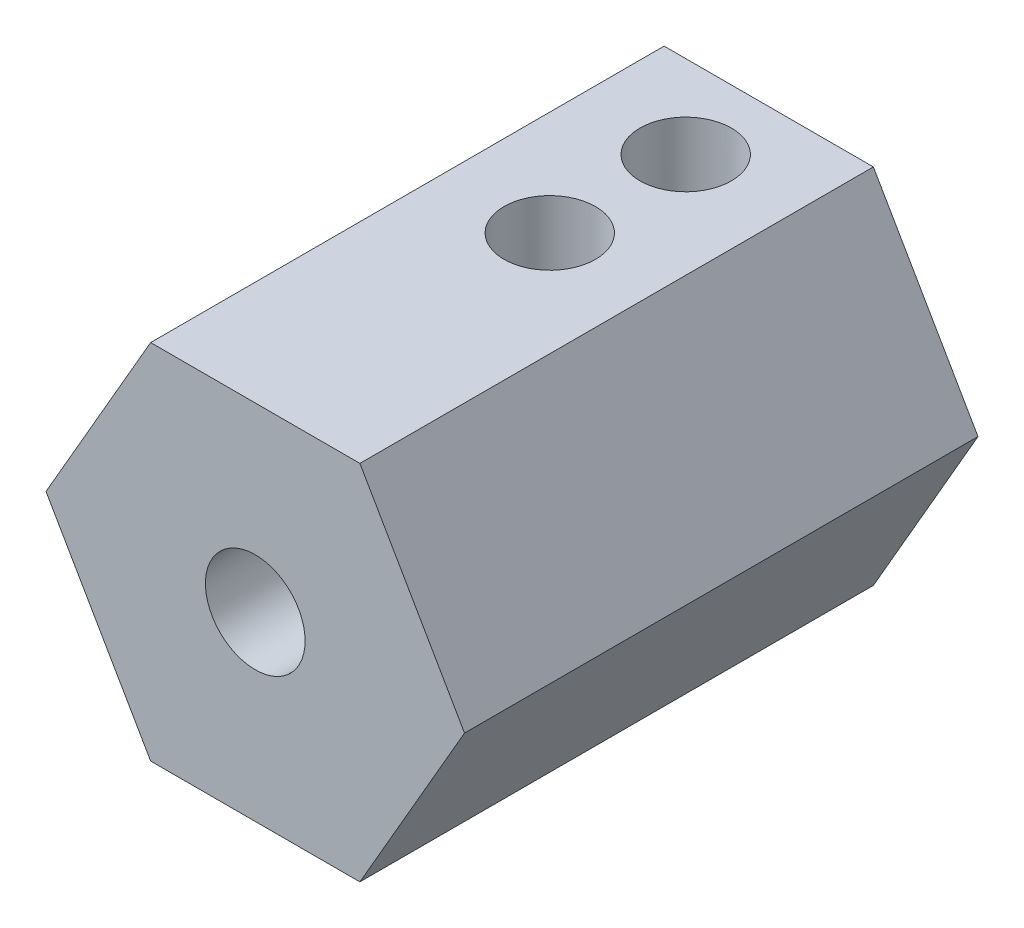
ISO-10303-21;
HEADER;
FILE_DESCRIPTION(('STEP AP214'),'2;1');
FILE_NAME('part.step','',(''),(''),'','','');
FILE_SCHEMA(('AUTOMOTIVE_DESIGN { 1 0 10303 214 1 1 1 1 }'));
ENDSEC;
DATA;
#1=APPLICATION_CONTEXT('core data for automotive mechanical design processes');
#2=APPLICATION_PROTOCOL_DEFINITION('international standard','automotive_design',2000,#1);
#3=PRODUCT_CONTEXT('',#1,'mechanical');
#4=PRODUCT('Part','Part','',(#3));
#5=PRODUCT_RELATED_PRODUCT_CATEGORY('part','',(#4));
#6=PRODUCT_DEFINITION_FORMATION('','',#4);
#7=PRODUCT_DEFINITION_CONTEXT('part definition',#1,'design');
#8=PRODUCT_DEFINITION('design','',#6,#7);
#9=PRODUCT_DEFINITION_SHAPE('','',#8);
#10=(LENGTH_UNIT() NAMED_UNIT(*) SI_UNIT(.MILLI.,.METRE.));
#11=(NAMED_UNIT(*) PLANE_ANGLE_UNIT() SI_UNIT($,.RADIAN.));
#12=(NAMED_UNIT(*) SI_UNIT($,.STERADIAN.) SOLID_ANGLE_UNIT());
#13=UNCERTAINTY_MEASURE_WITH_UNIT(LENGTH_MEASURE(1.E-05),#10,'distance_accuracy_value','');
#14=(GEOMETRIC_REPRESENTATION_CONTEXT(3) GLOBAL_UNCERTAINTY_ASSIGNED_CONTEXT((#13)) GLOBAL_UNIT_ASSIGNED_CONTEXT((#10,
#11,#12)) REPRESENTATION_CONTEXT('',''));
#15=CARTESIAN_POINT('',(0.,0.,0.));
#16=DIRECTION('',(0.,0.,1.));
#17=DIRECTION('',(1.,0.,0.));
#18=AXIS2_PLACEMENT_3D('',#15,#16,#17);
#19=CARTESIAN_POINT('',(0.,0.,10.));
#20=DIRECTION('',(0.,0.,-1.));
#21=DIRECTION('',(-1.,0.,0.));
#22=AXIS2_PLACEMENT_3D('',#19,#20,#21);
#23=CYLINDRICAL_SURFACE('',#22,2.025);
#24=CARTESIAN_POINT('',(0.,2.025,1.235));
#25=CARTESIAN_POINT('',(-0.0739928868056618,2.02499565190528,1.23500453512397));
#26=CARTESIAN_POINT('',(-0.148111325394092,2.02090129294461,1.24046521410863));
#27=CARTESIAN_POINT('',(-0.294023752283511,2.00489263007424,1.26196632140887));
#28=CARTESIAN_POINT('',(-0.365811185940954,1.99295799311726,1.27803425921649));
#29=CARTESIAN_POINT('',(-0.50454758984234,1.96241503224953,1.31966048772123));
#30=CARTESIAN_POINT('',(-0.571523148943039,1.94384742440607,1.34516091083884));
#31=CARTESIAN_POINT('',(-0.699799568974711,1.9014404117609,1.40445029071054));
#32=CARTESIAN_POINT('',(-0.761102223115065,1.8776026809794,1.43823661587343));
#33=CARTESIAN_POINT('',(-0.882766745900167,1.82377938276367,1.51644685777928));
#34=CARTESIAN_POINT('',(-0.942517219355931,1.79342912301261,1.56156561451561));
#35=CARTESIAN_POINT('',(-1.05411014702154,1.73020241051101,1.65931631383231));
#36=CARTESIAN_POINT('',(-1.10594004995473,1.69732206992881,1.71195993034544));
#37=CARTESIAN_POINT('',(-1.21101588768082,1.62447699595715,1.83539013856251));
#38=CARTESIAN_POINT('',(-1.26242821275426,1.58442438367897,1.90769277321892));
#39=CARTESIAN_POINT('',(-1.35255611678433,1.50820507978462,2.06170048447587));
#40=CARTESIAN_POINT('',(-1.39128927428173,1.47203305528554,2.14339232949708));
#41=CARTESIAN_POINT('',(-1.443530284921,1.42045979647629,2.28623627211062));
#42=CARTESIAN_POINT('',(-1.46113413550471,1.40218785640664,2.34483951504784));
#43=CARTESIAN_POINT('',(-1.48928662319109,1.37225214642226,2.46529281123202));
#44=CARTESIAN_POINT('',(-1.49985135050266,1.36057331521485,2.52713510881354));
#45=CARTESIAN_POINT('',(-1.51324765708928,1.34566661642272,2.65328000032195));
#46=CARTESIAN_POINT('',(-1.51601008617692,1.34251432818528,2.71759950427649));
#47=CARTESIAN_POINT('',(-1.51332532550786,1.34553830556832,2.84585886973358));
#48=CARTESIAN_POINT('',(-1.50787501717649,1.35171811481345,2.90979857776146));
#49=CARTESIAN_POINT('',(-1.49026122308344,1.37108998181118,3.02851690246804));
#50=CARTESIAN_POINT('',(-1.47886413619809,1.38347611341034,3.08355172244358));
#51=CARTESIAN_POINT('',(-1.45052143874708,1.41316475638683,3.1907868079349));
#52=CARTESIAN_POINT('',(-1.43357054940532,1.4304719430501,3.24298432140108));
#53=CARTESIAN_POINT('',(-1.38255613672714,1.48023293187179,3.37571050720384));
#54=CARTESIAN_POINT('',(-1.34440845602762,1.51540904884652,3.45364954944682));
#55=CARTESIAN_POINT('',(-1.25640314993998,1.58914874214825,3.60091761712356));
#56=CARTESIAN_POINT('',(-1.2065172183523,1.62772036358212,3.67022520048388));
#57=CARTESIAN_POINT('',(-1.09431931730027,1.70524441606206,3.80133641930668));
#58=CARTESIAN_POINT('',(-1.03173271116824,1.7441830027319,3.86291445023724));
#59=CARTESIAN_POINT('',(-0.895460138719062,1.81789894235418,3.97521039887268));
#60=CARTESIAN_POINT('',(-0.821796000181357,1.85268424257525,4.02594920912816));
#61=CARTESIAN_POINT('',(-0.680190487497888,1.90854254300791,4.10564175246017));
#62=CARTESIAN_POINT('',(-0.614098016930652,1.93096606100245,4.13692567702699));
#63=CARTESIAN_POINT('',(-0.476446044736619,1.9694459256481,4.19001855009483));
#64=CARTESIAN_POINT('',(-0.404890026525063,1.9855062895108,4.21183347743455));
#65=CARTESIAN_POINT('',(-0.257593419610673,2.0099430981957,4.24485653383498));
#66=CARTESIAN_POINT('',(-0.181830228152549,2.01827269227101,4.25600000349218));
#67=CARTESIAN_POINT('',(-0.0290402150354437,2.02623391100399,4.2666534107521));
#68=CARTESIAN_POINT('',(0.0479860833872775,2.02586905066897,4.26616804967582));
#69=CARTESIAN_POINT('',(0.192938393612172,2.01696535316096,4.25424760622859));
#70=CARTESIAN_POINT('',(0.261009683917031,2.00924027303096,4.24390258564786));
#71=CARTESIAN_POINT('',(0.394144043908506,1.98741752994079,4.21442018137838));
#72=CARTESIAN_POINT('',(0.459206459346709,1.97331848814401,4.19528089527016));
#73=CARTESIAN_POINT('',(0.587286498717926,1.93914346660441,4.14826599337024));
#74=CARTESIAN_POINT('',(0.650140041832414,1.91886610757916,4.12009402620657));
#75=CARTESIAN_POINT('',(0.770224139616118,1.87389879339671,4.05637110412412));
#76=CARTESIAN_POINT('',(0.827453923154029,1.84920823440526,4.02081913933268));
#77=CARTESIAN_POINT('',(0.94489750386441,1.79240828730101,3.936780489347));
#78=CARTESIAN_POINT('',(1.00400652229484,1.75974891449147,3.88712476006765));
#79=CARTESIAN_POINT('',(1.11363625190585,1.69250964066191,3.7800137044255));
#80=CARTESIAN_POINT('',(1.16413704660418,1.65792552504052,3.72254082928527));
#81=CARTESIAN_POINT('',(1.26479076695848,1.5828954211597,3.58892918745216));
#82=CARTESIAN_POINT('',(1.31308903983746,1.54257135051493,3.51131321975315));
#83=CARTESIAN_POINT('',(1.39575265690636,1.46818880450116,3.3462864806162));
#84=CARTESIAN_POINT('',(1.43016103210157,1.43411115958382,3.25890704745203));
#85=CARTESIAN_POINT('',(1.47248925798078,1.39030427653719,3.11109882081068));
#86=CARTESIAN_POINT('',(1.48550631183736,1.37626107893422,3.05342568063169));
#87=CARTESIAN_POINT('',(1.50474426700448,1.35520399562413,2.93575888012743));
#88=CARTESIAN_POINT('',(1.51098007761049,1.34817469193307,2.87577061201641));
#89=CARTESIAN_POINT('',(1.51620650324394,1.34229765473705,2.75477227566852));
#90=CARTESIAN_POINT('',(1.51516296373308,1.34348848965506,2.69375873234714));
#91=CARTESIAN_POINT('',(1.50584329033189,1.3539216008395,2.57295766096291));
#92=CARTESIAN_POINT('',(1.49755753043625,1.36317459287952,2.51317187305965));
#93=CARTESIAN_POINT('',(1.47170711784459,1.39109109020378,2.38304513500668));
#94=CARTESIAN_POINT('',(1.45245647034243,1.41142025529433,2.31340896079947));
#95=CARTESIAN_POINT('',(1.40524942835992,1.45842590385322,2.17940827814892));
#96=CARTESIAN_POINT('',(1.37727114996513,1.48511830256193,2.11505754073081));
#97=CARTESIAN_POINT('',(1.30273784307717,1.55136885295852,1.97108070986939));
#98=CARTESIAN_POINT('',(1.2531003028388,1.59222498348684,1.89364976432364));
#99=CARTESIAN_POINT('',(1.14092179117134,1.67444889745318,1.74905160300486));
#100=CARTESIAN_POINT('',(1.07836997199996,1.71581708336759,1.68189309898061));
#101=CARTESIAN_POINT('',(0.940349737037024,1.79520430249079,1.55853368396161));
#102=CARTESIAN_POINT('',(0.864790777571966,1.83319681867686,1.50241593058162));
#103=CARTESIAN_POINT('',(0.702018007126385,1.90145316200589,1.40412874983053));
#104=CARTESIAN_POINT('',(0.614832738366764,1.93173540415168,1.36192601566243));
#105=CARTESIAN_POINT('',(0.458223094182456,1.97362139699335,1.30430195673951));
#106=CARTESIAN_POINT('',(0.39110263626678,1.98809887628711,1.28465534362082));
#107=CARTESIAN_POINT('',(0.253803711121769,2.01022527103696,1.25477106897417));
#108=CARTESIAN_POINT('',(0.183634559151203,2.01789363761182,1.24450660363258));
#109=CARTESIAN_POINT('',(0.0942093811466056,2.02289578696553,1.23781371471486));
#110=CARTESIAN_POINT('',(0.0753950485035797,2.02368363611827,1.23675986526243));
#111=CARTESIAN_POINT('',(0.0377232017635754,2.02473633487149,1.23535237897461));
#112=CARTESIAN_POINT('',(0.0188656818006056,2.02500110861699,1.23499884369688));
#113=CARTESIAN_POINT('',(0.,2.025,1.235));
#114=B_SPLINE_CURVE_WITH_KNOTS('',3,(#24,#25,#26,#27,#28,#29,#30,#31,#32,#33,#34,#35,#36,#37,
#38,#39,#40,#41,#42,#43,#44,#45,#46,#47,#48,#49,#50,#51,#52,#53,#54,#55,#56,#57,#58,#59,#60,#61,
#62,#63,#64,#65,#66,#67,#68,#69,#70,#71,#72,#73,#74,#75,#76,#77,#78,#79,#80,#81,#82,#83,#84,#85,
#86,#87,#88,#89,#90,#91,#92,#93,#94,#95,#96,#97,#98,#99,#100,#101,#102,#103,#104,#105,#106,#107,
#108,#109,#110,#111,#112,#113),.UNSPECIFIED.,.T.,.F.,(4,2,2,2,2,2,2,2,2,2,2,2,2,2,2,2,2,2,2,2,2,
2,2,2,2,2,2,2,2,2,2,2,2,2,2,2,2,2,2,2,2,2,2,2,4),(0.,0.221895599142627,0.444368948235988,
0.665499484915247,0.886559881582525,1.12806569545117,1.36995032762094,1.66075484903069,
1.95115447116898,2.14208603976122,2.33257966093106,2.52475636952016,2.71700607063708,
2.88903467847803,3.06122727266009,3.34060465381823,3.62066277152428,3.90758631915396,
4.19395173073889,4.4224819275015,4.65086761690028,4.88062852215421,5.11029654089535,
5.31720076274683,5.52414976424107,5.7387363438516,5.95335230668855,6.20390249176825,
6.45502471955811,6.7534144301631,7.05087249892815,7.23249545476855,7.41371828052448,
7.59579196950383,7.77810803056935,8.00202975779208,8.22651752826005,8.52693409339032,
8.82760403680624,9.13045850005745,9.43258270168355,9.64597557565269,9.85875688550531,
9.91532455040445,9.97190041799257),.UNSPECIFIED.);
#115=CARTESIAN_POINT('',(0.,2.025,1.235));
#116=VERTEX_POINT('',#115);
#117=EDGE_CURVE('E147',#116,#116,#114,.T.);
#118=ORIENTED_EDGE('',*,*,#117,.T.);
#119=EDGE_LOOP('',(#118));
#120=FACE_BOUND('',#119,.T.);
#121=CARTESIAN_POINT('',(0.,0.,10.));
#122=DIRECTION('',(0.,0.,1.));
#123=DIRECTION('',(1.,0.,0.));
#124=AXIS2_PLACEMENT_3D('',#121,#122,#123);
#125=CIRCLE('',#124,2.025);
#126=CARTESIAN_POINT('',(2.025,0.,10.));
#127=VERTEX_POINT('',#126);
#128=EDGE_CURVE('E144',#127,#127,#125,.T.);
#129=ORIENTED_EDGE('',*,*,#128,.T.);
#130=EDGE_LOOP('',(#129));
#131=FACE_BOUND('',#130,.T.);
#132=CARTESIAN_POINT('',(0.,0.,0.));
#133=DIRECTION('',(0.,0.,1.));
#134=DIRECTION('',(1.,0.,0.));
#135=AXIS2_PLACEMENT_3D('',#132,#133,#134);
#136=CIRCLE('',#135,2.025);
#137=CARTESIAN_POINT('',(2.025,0.,0.));
#138=VERTEX_POINT('',#137);
#139=EDGE_CURVE('E128',#138,#138,#136,.F.);
#140=ORIENTED_EDGE('',*,*,#139,.T.);
#141=EDGE_LOOP('',(#140));
#142=FACE_BOUND('',#141,.T.);
#143=CARTESIAN_POINT('',(0.,2.025,5.735));
#144=CARTESIAN_POINT('',(-0.0739928868056618,2.02499565190528,5.73500453512397));
#145=CARTESIAN_POINT('',(-0.148111325394092,2.02090129294461,5.74046521410863));
#146=CARTESIAN_POINT('',(-0.294023752283511,2.00489263007424,5.76196632140887));
#147=CARTESIAN_POINT('',(-0.365811185940954,1.99295799311726,5.77803425921649));
#148=CARTESIAN_POINT('',(-0.50454758984234,1.96241503224953,5.81966048772123));
#149=CARTESIAN_POINT('',(-0.571523148943039,1.94384742440607,5.84516091083884));
#150=CARTESIAN_POINT('',(-0.699799568974711,1.9014404117609,5.90445029071054));
#151=CARTESIAN_POINT('',(-0.761102223115066,1.8776026809794,5.93823661587343));
#152=CARTESIAN_POINT('',(-0.882766745900167,1.82377938276367,6.01644685777929));
#153=CARTESIAN_POINT('',(-0.942517219355931,1.79342912301261,6.06156561451561));
#154=CARTESIAN_POINT('',(-1.05411014702154,1.730202410511,6.15931631383231));
#155=CARTESIAN_POINT('',(-1.10594004995473,1.69732206992881,6.21195993034544));
#156=CARTESIAN_POINT('',(-1.21101588768082,1.62447699595715,6.33539013856251));
#157=CARTESIAN_POINT('',(-1.26242821275426,1.58442438367897,6.40769277321892));
#158=CARTESIAN_POINT('',(-1.35255611678434,1.50820507978462,6.56170048447587));
#159=CARTESIAN_POINT('',(-1.39128927428173,1.47203305528554,6.64339232949708));
#160=CARTESIAN_POINT('',(-1.443530284921,1.42045979647629,6.78623627211062));
#161=CARTESIAN_POINT('',(-1.46113413550471,1.40218785640664,6.84483951504784));
#162=CARTESIAN_POINT('',(-1.48928662319109,1.37225214642226,6.96529281123202));
#163=CARTESIAN_POINT('',(-1.49985135050266,1.36057331521485,7.02713510881354));
#164=CARTESIAN_POINT('',(-1.51324765708928,1.34566661642272,7.15328000032195));
#165=CARTESIAN_POINT('',(-1.51601008617692,1.34251432818528,7.21759950427649));
#166=CARTESIAN_POINT('',(-1.51332532550786,1.34553830556832,7.34585886973358));
#167=CARTESIAN_POINT('',(-1.50787501717649,1.35171811481345,7.40979857776146));
#168=CARTESIAN_POINT('',(-1.49026122308344,1.37108998181118,7.52851690246804));
#169=CARTESIAN_POINT('',(-1.47886413619809,1.38347611341034,7.58355172244359));
#170=CARTESIAN_POINT('',(-1.45052143874708,1.41316475638683,7.6907868079349));
#171=CARTESIAN_POINT('',(-1.43357054940532,1.4304719430501,7.74298432140108));
#172=CARTESIAN_POINT('',(-1.38255613672714,1.48023293187179,7.87571050720385));
#173=CARTESIAN_POINT('',(-1.34440845602762,1.51540904884652,7.95364954944682));
#174=CARTESIAN_POINT('',(-1.25640314993998,1.58914874214825,8.10091761712356));
#175=CARTESIAN_POINT('',(-1.2065172183523,1.62772036358212,8.17022520048388));
#176=CARTESIAN_POINT('',(-1.09431931730027,1.70524441606206,8.30133641930668));
#177=CARTESIAN_POINT('',(-1.03173271116824,1.7441830027319,8.36291445023725));
#178=CARTESIAN_POINT('',(-0.89546013871906,1.81789894235419,8.47521039887268));
#179=CARTESIAN_POINT('',(-0.821796000181355,1.85268424257525,8.52594920912816));
#180=CARTESIAN_POINT('',(-0.680190487497886,1.90854254300791,8.60564175246017));
#181=CARTESIAN_POINT('',(-0.61409801693065,1.93096606100245,8.636925677027));
#182=CARTESIAN_POINT('',(-0.476446044736617,1.9694459256481,8.69001855009483));
#183=CARTESIAN_POINT('',(-0.404890026525061,1.9855062895108,8.71183347743455));
#184=CARTESIAN_POINT('',(-0.25759341961067,2.0099430981957,8.74485653383498));
#185=CARTESIAN_POINT('',(-0.181830228152546,2.01827269227101,8.75600000349218));
#186=CARTESIAN_POINT('',(-0.0290402150354417,2.02623391100399,8.7666534107521));
#187=CARTESIAN_POINT('',(0.0479860833872792,2.02586905066897,8.76616804967582));
#188=CARTESIAN_POINT('',(0.192938393612173,2.01696535316096,8.75424760622859));
#189=CARTESIAN_POINT('',(0.261009683917032,2.00924027303096,8.74390258564786));
#190=CARTESIAN_POINT('',(0.394144043908507,1.98741752994079,8.71442018137838));
#191=CARTESIAN_POINT('',(0.45920645934671,1.97331848814401,8.69528089527016));
#192=CARTESIAN_POINT('',(0.587286498717927,1.93914346660441,8.64826599337024));
#193=CARTESIAN_POINT('',(0.650140041832415,1.91886610757916,8.62009402620657));
#194=CARTESIAN_POINT('',(0.770224139616119,1.87389879339671,8.55637110412412));
#195=CARTESIAN_POINT('',(0.82745392315403,1.84920823440526,8.52081913933268));
#196=CARTESIAN_POINT('',(0.944897503864411,1.79240828730101,8.436780489347));
#197=CARTESIAN_POINT('',(1.00400652229484,1.75974891449146,8.38712476006765));
#198=CARTESIAN_POINT('',(1.11363625190585,1.69250964066191,8.28001370442549));
#199=CARTESIAN_POINT('',(1.16413704660418,1.65792552504052,8.22254082928527));
#200=CARTESIAN_POINT('',(1.26479076695848,1.5828954211597,8.08892918745215));
#201=CARTESIAN_POINT('',(1.31308903983746,1.54257135051493,8.01131321975314));
#202=CARTESIAN_POINT('',(1.39575265690636,1.46818880450116,7.84628648061619));
#203=CARTESIAN_POINT('',(1.43016103210157,1.43411115958382,7.75890704745202));
#204=CARTESIAN_POINT('',(1.47248925798079,1.39030427653719,7.61109882081068));
#205=CARTESIAN_POINT('',(1.48550631183736,1.37626107893422,7.55342568063169));
#206=CARTESIAN_POINT('',(1.50474426700448,1.35520399562413,7.43575888012743));
#207=CARTESIAN_POINT('',(1.51098007761049,1.34817469193307,7.37577061201641));
#208=CARTESIAN_POINT('',(1.51620650324394,1.34229765473705,7.25477227566852));
#209=CARTESIAN_POINT('',(1.51516296373308,1.34348848965506,7.19375873234714));
#210=CARTESIAN_POINT('',(1.50584329033189,1.3539216008395,7.07295766096292));
#211=CARTESIAN_POINT('',(1.49755753043625,1.36317459287952,7.01317187305965));
#212=CARTESIAN_POINT('',(1.47170711784459,1.39109109020378,6.88304513500668));
#213=CARTESIAN_POINT('',(1.45245647034243,1.41142025529433,6.81340896079947));
#214=CARTESIAN_POINT('',(1.40524942835992,1.45842590385322,6.67940827814892));
#215=CARTESIAN_POINT('',(1.37727114996513,1.48511830256193,6.61505754073081));
#216=CARTESIAN_POINT('',(1.30273784307717,1.55136885295852,6.47108070986939));
#217=CARTESIAN_POINT('',(1.2531003028388,1.59222498348684,6.39364976432364));
#218=CARTESIAN_POINT('',(1.14092179117134,1.67444889745318,6.24905160300486));
#219=CARTESIAN_POINT('',(1.07836997199996,1.71581708336759,6.18189309898061));
#220=CARTESIAN_POINT('',(0.940349737037024,1.79520430249079,6.05853368396161));
#221=CARTESIAN_POINT('',(0.864790777571966,1.83319681867686,6.00241593058162));
#222=CARTESIAN_POINT('',(0.702018007126386,1.90145316200589,5.90412874983053));
#223=CARTESIAN_POINT('',(0.614832738366765,1.93173540415168,5.86192601566243));
#224=CARTESIAN_POINT('',(0.458223094182457,1.97362139699335,5.80430195673951));
#225=CARTESIAN_POINT('',(0.39110263626678,1.98809887628711,5.78465534362082));
#226=CARTESIAN_POINT('',(0.25380371112177,2.01022527103696,5.75477106897417));
#227=CARTESIAN_POINT('',(0.183634559151204,2.01789363761182,5.74450660363258));
#228=CARTESIAN_POINT('',(0.0942093811466054,2.02289578696553,5.73781371471486));
#229=CARTESIAN_POINT('',(0.0753950485035789,2.02368363611827,5.73675986526243));
#230=CARTESIAN_POINT('',(0.0377232017635744,2.02473633487149,5.73535237897461));
#231=CARTESIAN_POINT('',(0.0188656818006051,2.02500110861699,5.73499884369688));
#232=CARTESIAN_POINT('',(0.,2.025,5.735));
#233=B_SPLINE_CURVE_WITH_KNOTS('',3,(#143,#144,#145,#146,#147,#148,#149,#150,#151,#152,#153,
#154,#155,#156,#157,#158,#159,#160,#161,#162,#163,#164,#165,#166,#167,#168,#169,#170,#171,#172,
#173,#174,#175,#176,#177,#178,#179,#180,#181,#182,#183,#184,#185,#186,#187,#188,#189,#190,#191,
#192,#193,#194,#195,#196,#197,#198,#199,#200,#201,#202,#203,#204,#205,#206,#207,#208,#209,#210,
#211,#212,#213,#214,#215,#216,#217,#218,#219,#220,#221,#222,#223,#224,#225,#226,#227,#228,#229,
#230,#231,#232),.UNSPECIFIED.,.T.,.F.,(4,2,2,2,2,2,2,2,2,2,2,2,2,2,2,2,2,2,2,2,2,2,2,2,2,2,2,2,
2,2,2,2,2,2,2,2,2,2,2,2,2,2,2,2,4),(0.,0.221895599142627,0.444368948235988,0.665499484915247,
0.886559881582525,1.12806569545117,1.36995032762094,1.66075484903069,1.95115447116899,
2.14208603976122,2.33257966093107,2.52475636952016,2.71700607063709,2.88903467847803,
3.06122727266009,3.34060465381823,3.62066277152428,3.90758631915396,4.19395173073889,
4.4224819275015,4.65086761690029,4.88062852215421,5.11029654089535,5.31720076274683,
5.52414976424107,5.7387363438516,5.95335230668855,6.20390249176825,6.45502471955811,
6.75341443016311,7.05087249892815,7.23249545476855,7.41371828052448,7.59579196950383,
7.77810803056935,8.00202975779208,8.22651752826005,8.52693409339032,8.82760403680624,
9.13045850005745,9.43258270168355,9.64597557565269,9.85875688550531,9.91532455040446,
9.97190041799257),.UNSPECIFIED.);
#234=CARTESIAN_POINT('',(0.,2.025,5.735));
#235=VERTEX_POINT('',#234);
#236=EDGE_CURVE('E160',#235,#235,#233,.T.);
#237=ORIENTED_EDGE('',*,*,#236,.T.);
#238=EDGE_LOOP('',(#237));
#239=FACE_BOUND('',#238,.T.);
#240=ADVANCED_FACE('F39',(#120,#131,#142,#239),#23,.F.);
#241=CARTESIAN_POINT('',(3.46410161513776,-6.,17.));
#242=DIRECTION('',(-0.866025403784439,0.5,0.));
#243=DIRECTION('',(-0.5,-0.866025403784439,0.));
#244=AXIS2_PLACEMENT_3D('',#241,#242,#243);
#245=PLANE('',#244);
#246=DIRECTION('',(0.5,0.866025403784439,0.));
#247=VECTOR('',#246,1.);
#248=CARTESIAN_POINT('',(3.46410161513776,-6.,0.));
#249=LINE('',#248,#247);
#250=CARTESIAN_POINT('',(3.46410161513776,-6.,0.));
#251=VERTEX_POINT('',#250);
#252=CARTESIAN_POINT('',(6.92820323027551,0.,0.));
#253=VERTEX_POINT('',#252);
#254=EDGE_CURVE('E127',#251,#253,#249,.T.);
#255=ORIENTED_EDGE('',*,*,#254,.T.);
#256=DIRECTION('',(0.,0.,-1.));
#257=VECTOR('',#256,1.);
#258=CARTESIAN_POINT('',(6.92820323027551,0.,17.));
#259=LINE('',#258,#257);
#260=CARTESIAN_POINT('',(6.92820323027551,0.,17.));
#261=VERTEX_POINT('',#260);
#262=EDGE_CURVE('E11',#261,#253,#259,.T.);
#263=ORIENTED_EDGE('',*,*,#262,.F.);
#264=DIRECTION('',(0.5,0.866025403784439,0.));
#265=VECTOR('',#264,1.);
#266=CARTESIAN_POINT('',(3.46410161513776,-6.,17.));
#267=LINE('',#266,#265);
#268=CARTESIAN_POINT('',(3.46410161513776,-6.,17.));
#269=VERTEX_POINT('',#268);
#270=EDGE_CURVE('E140',#269,#261,#267,.T.);
#271=ORIENTED_EDGE('',*,*,#270,.F.);
#272=DIRECTION('',(0.,0.,-1.));
#273=VECTOR('',#272,1.);
#274=CARTESIAN_POINT('',(3.46410161513776,-6.,17.));
#275=LINE('',#274,#273);
#276=EDGE_CURVE('E125',#269,#251,#275,.T.);
#277=ORIENTED_EDGE('',*,*,#276,.T.);
#278=EDGE_LOOP('',(#255,#263,#271,#277));
#279=FACE_BOUND('',#278,.T.);
#280=ADVANCED_FACE('F41',(#279),#245,.F.);
#281=CARTESIAN_POINT('',(6.92820323027551,0.,17.));
#282=DIRECTION('',(-0.866025403784439,-0.5,0.));
#283=DIRECTION('',(0.5,-0.866025403784439,0.));
#284=AXIS2_PLACEMENT_3D('',#281,#282,#283);
#285=PLANE('',#284);
#286=DIRECTION('',(-0.5,0.866025403784439,0.));
#287=VECTOR('',#286,1.);
#288=CARTESIAN_POINT('',(6.92820323027551,0.,0.));
#289=LINE('',#288,#287);
#290=CARTESIAN_POINT('',(3.46410161513776,6.,0.));
#291=VERTEX_POINT('',#290);
#292=EDGE_CURVE('E129',#253,#291,#289,.T.);
#293=ORIENTED_EDGE('',*,*,#292,.T.);
#294=DIRECTION('',(0.,0.,-1.));
#295=VECTOR('',#294,1.);
#296=CARTESIAN_POINT('',(3.46410161513776,6.,17.));
#297=LINE('',#296,#295);
#298=CARTESIAN_POINT('',(3.46410161513776,6.,17.));
#299=VERTEX_POINT('',#298);
#300=EDGE_CURVE('E47',#299,#291,#297,.T.);
#301=ORIENTED_EDGE('',*,*,#300,.F.);
#302=DIRECTION('',(-0.5,0.866025403784439,0.));
#303=VECTOR('',#302,1.);
#304=CARTESIAN_POINT('',(6.92820323027551,0.,17.));
#305=LINE('',#304,#303);
#306=EDGE_CURVE('E92',#261,#299,#305,.T.);
#307=ORIENTED_EDGE('',*,*,#306,.F.);
#308=ORIENTED_EDGE('',*,*,#262,.T.);
#309=EDGE_LOOP('',(#293,#301,#307,#308));
#310=FACE_BOUND('',#309,.T.);
#311=ADVANCED_FACE('F188',(#310),#285,.F.);
#312=CARTESIAN_POINT('',(3.46410161513776,6.,17.));
#313=DIRECTION('',(0.,-1.,0.));
#314=DIRECTION('',(1.,0.,0.));
#315=AXIS2_PLACEMENT_3D('',#312,#313,#314);
#316=PLANE('',#315);
#317=CARTESIAN_POINT('',(0.,6.,7.25));
#318=DIRECTION('',(0.,-1.,0.));
#319=DIRECTION('',(1.,0.,0.));
#320=AXIS2_PLACEMENT_3D('',#317,#318,#319);
#321=CIRCLE('',#320,1.515);
#322=CARTESIAN_POINT('',(1.515,6.,7.25));
#323=VERTEX_POINT('',#322);
#324=EDGE_CURVE('E43',#323,#323,#321,.F.);
#325=ORIENTED_EDGE('',*,*,#324,.F.);
#326=EDGE_LOOP('',(#325));
#327=FACE_BOUND('',#326,.T.);
#328=CARTESIAN_POINT('',(0.,6.,2.75));
#329=DIRECTION('',(0.,-1.,0.));
#330=DIRECTION('',(1.,0.,0.));
#331=AXIS2_PLACEMENT_3D('',#328,#329,#330);
#332=CIRCLE('',#331,1.515);
#333=CARTESIAN_POINT('',(1.515,6.,2.75));
#334=VERTEX_POINT('',#333);
#335=EDGE_CURVE('E149',#334,#334,#332,.F.);
#336=ORIENTED_EDGE('',*,*,#335,.F.);
#337=EDGE_LOOP('',(#336));
#338=FACE_BOUND('',#337,.T.);
#339=DIRECTION('',(-1.,0.,0.));
#340=VECTOR('',#339,1.);
#341=CARTESIAN_POINT('',(3.46410161513776,6.,0.));
#342=LINE('',#341,#340);
#343=CARTESIAN_POINT('',(-3.46410161513775,6.,0.));
#344=VERTEX_POINT('',#343);
#345=EDGE_CURVE('E134',#291,#344,#342,.T.);
#346=ORIENTED_EDGE('',*,*,#345,.T.);
#347=DIRECTION('',(0.,0.,-1.));
#348=VECTOR('',#347,1.);
#349=CARTESIAN_POINT('',(-3.46410161513775,6.,17.));
#350=LINE('',#349,#348);
#351=CARTESIAN_POINT('',(-3.46410161513775,6.,17.));
#352=VERTEX_POINT('',#351);
#353=EDGE_CURVE('E119',#352,#344,#350,.T.);
#354=ORIENTED_EDGE('',*,*,#353,.F.);
#355=DIRECTION('',(-1.,0.,0.));
#356=VECTOR('',#355,1.);
#357=CARTESIAN_POINT('',(3.46410161513776,6.,17.));
#358=LINE('',#357,#356);
#359=EDGE_CURVE('E107',#299,#352,#358,.T.);
#360=ORIENTED_EDGE('',*,*,#359,.F.);
#361=ORIENTED_EDGE('',*,*,#300,.T.);
#362=EDGE_LOOP('',(#346,#354,#360,#361));
#363=FACE_BOUND('',#362,.T.);
#364=ADVANCED_FACE('F217',(#327,#338,#363),#316,.F.);
#365=CARTESIAN_POINT('',(-3.46410161513775,6.,17.));
#366=DIRECTION('',(0.866025403784439,-0.5,0.));
#367=DIRECTION('',(0.5,0.866025403784439,0.));
#368=AXIS2_PLACEMENT_3D('',#365,#366,#367);
#369=PLANE('',#368);
#370=DIRECTION('',(-0.5,-0.866025403784439,0.));
#371=VECTOR('',#370,1.);
#372=CARTESIAN_POINT('',(-3.46410161513775,6.,0.));
#373=LINE('',#372,#371);
#374=CARTESIAN_POINT('',(-6.92820323027551,0.,0.));
#375=VERTEX_POINT('',#374);
#376=EDGE_CURVE('E117',#344,#375,#373,.T.);
#377=ORIENTED_EDGE('',*,*,#376,.T.);
#378=DIRECTION('',(0.,0.,-1.));
#379=VECTOR('',#378,1.);
#380=CARTESIAN_POINT('',(-6.92820323027551,0.,17.));
#381=LINE('',#380,#379);
#382=CARTESIAN_POINT('',(-6.92820323027551,0.,17.));
#383=VERTEX_POINT('',#382);
#384=EDGE_CURVE('E114',#383,#375,#381,.T.);
#385=ORIENTED_EDGE('',*,*,#384,.F.);
#386=DIRECTION('',(-0.5,-0.866025403784439,0.));
#387=VECTOR('',#386,1.);
#388=CARTESIAN_POINT('',(-3.46410161513775,6.,17.));
#389=LINE('',#388,#387);
#390=EDGE_CURVE('E105',#352,#383,#389,.T.);
#391=ORIENTED_EDGE('',*,*,#390,.F.);
#392=ORIENTED_EDGE('',*,*,#353,.T.);
#393=EDGE_LOOP('',(#377,#385,#391,#392));
#394=FACE_BOUND('',#393,.T.);
#395=ADVANCED_FACE('F111',(#394),#369,.F.);
#396=CARTESIAN_POINT('',(-6.92820323027551,0.,17.));
#397=DIRECTION('',(0.866025403784439,0.5,0.));
#398=DIRECTION('',(-0.5,0.866025403784439,0.));
#399=AXIS2_PLACEMENT_3D('',#396,#397,#398);
#400=PLANE('',#399);
#401=DIRECTION('',(0.5,-0.866025403784439,0.));
#402=VECTOR('',#401,1.);
#403=CARTESIAN_POINT('',(-6.92820323027551,0.,0.));
#404=LINE('',#403,#402);
#405=CARTESIAN_POINT('',(-3.46410161513776,-6.,0.));
#406=VERTEX_POINT('',#405);
#407=EDGE_CURVE('E81',#375,#406,#404,.T.);
#408=ORIENTED_EDGE('',*,*,#407,.T.);
#409=DIRECTION('',(0.,0.,-1.));
#410=VECTOR('',#409,1.);
#411=CARTESIAN_POINT('',(-3.46410161513776,-6.,17.));
#412=LINE('',#411,#410);
#413=CARTESIAN_POINT('',(-3.46410161513776,-6.,17.));
#414=VERTEX_POINT('',#413);
#415=EDGE_CURVE('E120',#414,#406,#412,.T.);
#416=ORIENTED_EDGE('',*,*,#415,.F.);
#417=DIRECTION('',(0.5,-0.866025403784439,0.));
#418=VECTOR('',#417,1.);
#419=CARTESIAN_POINT('',(-6.92820323027551,0.,17.));
#420=LINE('',#419,#418);
#421=EDGE_CURVE('E106',#383,#414,#420,.T.);
#422=ORIENTED_EDGE('',*,*,#421,.F.);
#423=ORIENTED_EDGE('',*,*,#384,.T.);
#424=EDGE_LOOP('',(#408,#416,#422,#423));
#425=FACE_BOUND('',#424,.T.);
#426=ADVANCED_FACE('F118',(#425),#400,.F.);
#427=CARTESIAN_POINT('',(-3.46410161513776,-6.,17.));
#428=DIRECTION('',(0.,1.,0.));
#429=DIRECTION('',(-1.,0.,0.));
#430=AXIS2_PLACEMENT_3D('',#427,#428,#429);
#431=PLANE('',#430);
#432=DIRECTION('',(1.,0.,0.));
#433=VECTOR('',#432,1.);
#434=CARTESIAN_POINT('',(-3.46410161513776,-6.,0.));
#435=LINE('',#434,#433);
#436=EDGE_CURVE('E87',#406,#251,#435,.T.);
#437=ORIENTED_EDGE('',*,*,#436,.T.);
#438=ORIENTED_EDGE('',*,*,#276,.F.);
#439=DIRECTION('',(1.,0.,0.));
#440=VECTOR('',#439,1.);
#441=CARTESIAN_POINT('',(-3.46410161513776,-6.,17.));
#442=LINE('',#441,#440);
#443=EDGE_CURVE('E59',#414,#269,#442,.T.);
#444=ORIENTED_EDGE('',*,*,#443,.F.);
#445=ORIENTED_EDGE('',*,*,#415,.T.);
#446=EDGE_LOOP('',(#437,#438,#444,#445));
#447=FACE_BOUND('',#446,.T.);
#448=ADVANCED_FACE('F222',(#447),#431,.F.);
#449=CARTESIAN_POINT('',(0.,0.,17.));
#450=DIRECTION('',(0.,0.,1.));
#451=DIRECTION('',(1.,0.,0.));
#452=AXIS2_PLACEMENT_3D('',#449,#450,#451);
#453=PLANE('',#452);
#454=CARTESIAN_POINT('',(0.,0.,17.));
#455=DIRECTION('',(0.,0.,1.));
#456=DIRECTION('',(1.,0.,0.));
#457=AXIS2_PLACEMENT_3D('',#454,#455,#456);
#458=CIRCLE('',#457,1.65);
#459=CARTESIAN_POINT('',(1.65,0.,17.));
#460=VERTEX_POINT('',#459);
#461=EDGE_CURVE('E146',#460,#460,#458,.F.);
#462=ORIENTED_EDGE('',*,*,#461,.T.);
#463=EDGE_LOOP('',(#462));
#464=FACE_BOUND('',#463,.T.);
#465=ORIENTED_EDGE('',*,*,#270,.T.);
#466=ORIENTED_EDGE('',*,*,#306,.T.);
#467=ORIENTED_EDGE('',*,*,#359,.T.);
#468=ORIENTED_EDGE('',*,*,#390,.T.);
#469=ORIENTED_EDGE('',*,*,#421,.T.);
#470=ORIENTED_EDGE('',*,*,#443,.T.);
#471=EDGE_LOOP('',(#465,#466,#467,#468,#469,#470));
#472=FACE_BOUND('',#471,.T.);
#473=ADVANCED_FACE('F102',(#464,#472),#453,.T.);
#474=CARTESIAN_POINT('',(0.,0.,0.));
#475=DIRECTION('',(0.,0.,1.));
#476=DIRECTION('',(1.,0.,0.));
#477=AXIS2_PLACEMENT_3D('',#474,#475,#476);
#478=PLANE('',#477);
#479=ORIENTED_EDGE('',*,*,#139,.F.);
#480=EDGE_LOOP('',(#479));
#481=FACE_BOUND('',#480,.T.);
#482=ORIENTED_EDGE('',*,*,#254,.F.);
#483=ORIENTED_EDGE('',*,*,#436,.F.);
#484=ORIENTED_EDGE('',*,*,#407,.F.);
#485=ORIENTED_EDGE('',*,*,#376,.F.);
#486=ORIENTED_EDGE('',*,*,#345,.F.);
#487=ORIENTED_EDGE('',*,*,#292,.F.);
#488=EDGE_LOOP('',(#482,#483,#484,#485,#486,#487));
#489=FACE_BOUND('',#488,.T.);
#490=ADVANCED_FACE('F171',(#481,#489),#478,.F.);
#491=CARTESIAN_POINT('',(0.,0.,10.));
#492=DIRECTION('',(0.,0.,1.));
#493=DIRECTION('',(1.,0.,0.));
#494=AXIS2_PLACEMENT_3D('',#491,#492,#493);
#495=PLANE('',#494);
#496=CARTESIAN_POINT('',(0.,0.,10.));
#497=DIRECTION('',(0.,0.,1.));
#498=DIRECTION('',(1.,0.,0.));
#499=AXIS2_PLACEMENT_3D('',#496,#497,#498);
#500=CIRCLE('',#499,1.65);
#501=CARTESIAN_POINT('',(1.65,0.,10.));
#502=VERTEX_POINT('',#501);
#503=EDGE_CURVE('E148',#502,#502,#500,.F.);
#504=ORIENTED_EDGE('',*,*,#503,.F.);
#505=EDGE_LOOP('',(#504));
#506=FACE_BOUND('',#505,.T.);
#507=ORIENTED_EDGE('',*,*,#128,.F.);
#508=EDGE_LOOP('',(#507));
#509=FACE_BOUND('',#508,.T.);
#510=ADVANCED_FACE('F172',(#506,#509),#495,.F.);
#511=CARTESIAN_POINT('',(0.,0.,17.1));
#512=DIRECTION('',(0.,0.,-1.));
#513=DIRECTION('',(-1.,0.,0.));
#514=AXIS2_PLACEMENT_3D('',#511,#512,#513);
#515=CYLINDRICAL_SURFACE('',#514,1.65);
#516=ORIENTED_EDGE('',*,*,#461,.F.);
#517=EDGE_LOOP('',(#516));
#518=FACE_BOUND('',#517,.T.);
#519=ORIENTED_EDGE('',*,*,#503,.T.);
#520=EDGE_LOOP('',(#519));
#521=FACE_BOUND('',#520,.T.);
#522=ADVANCED_FACE('F170',(#518,#521),#515,.F.);
#523=CARTESIAN_POINT('',(0.,7.,2.75));
#524=DIRECTION('',(0.,-1.,0.));
#525=DIRECTION('',(0.,0.,-1.));
#526=AXIS2_PLACEMENT_3D('',#523,#524,#525);
#527=CYLINDRICAL_SURFACE('',#526,1.515);
#528=ORIENTED_EDGE('',*,*,#117,.F.);
#529=EDGE_LOOP('',(#528));
#530=FACE_BOUND('',#529,.T.);
#531=ORIENTED_EDGE('',*,*,#335,.T.);
#532=EDGE_LOOP('',(#531));
#533=FACE_BOUND('',#532,.T.);
#534=ADVANCED_FACE('F161',(#530,#533),#527,.F.);
#535=CARTESIAN_POINT('',(0.,7.,7.25));
#536=DIRECTION('',(0.,-1.,0.));
#537=DIRECTION('',(0.,0.,-1.));
#538=AXIS2_PLACEMENT_3D('',#535,#536,#537);
#539=CYLINDRICAL_SURFACE('',#538,1.515);
#540=ORIENTED_EDGE('',*,*,#236,.F.);
#541=EDGE_LOOP('',(#540));
#542=FACE_BOUND('',#541,.T.);
#543=ORIENTED_EDGE('',*,*,#324,.T.);
#544=EDGE_LOOP('',(#543));
#545=FACE_BOUND('',#544,.T.);
#546=ADVANCED_FACE('F167',(#542,#545),#539,.F.);
#547=CLOSED_SHELL('',(#240,#280,#311,#364,#395,#426,#448,#473,#490,#510,#522,#534,#546));
#548=MANIFOLD_SOLID_BREP('B2',#547);
#549=ADVANCED_BREP_SHAPE_REPRESENTATION('',(#18,#548),#14);
#550=SHAPE_DEFINITION_REPRESENTATION(#9,#549);
ENDSEC;
END-ISO-10303-21;
